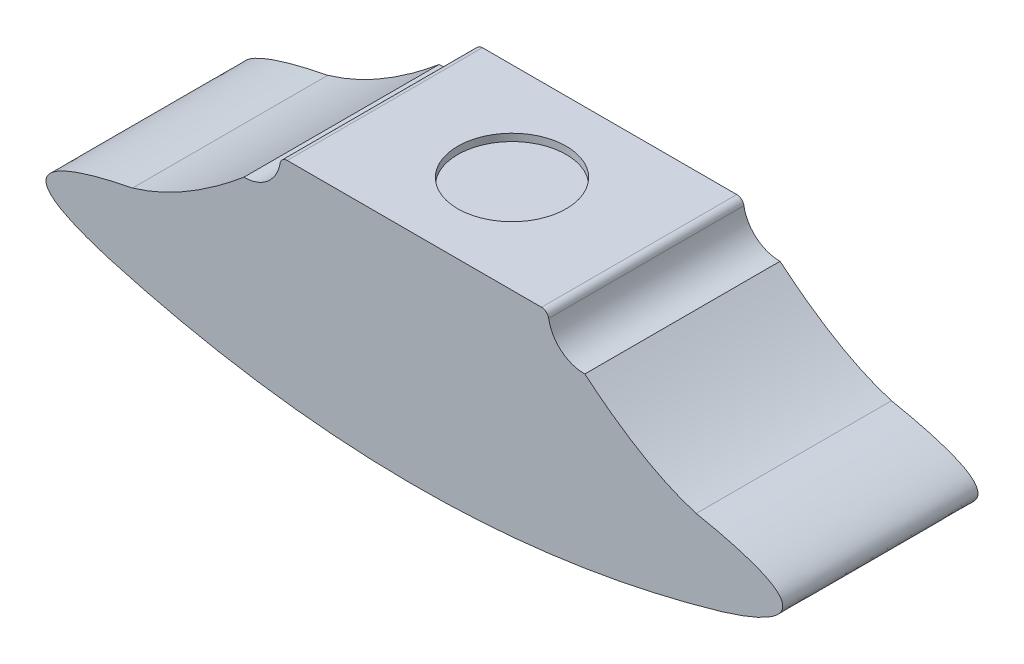
ISO-10303-21;
HEADER;
FILE_DESCRIPTION(('STEP AP214'),'2;1');
FILE_NAME('part.step','',(''),(''),'','','');
FILE_SCHEMA(('AUTOMOTIVE_DESIGN { 1 0 10303 214 1 1 1 1 }'));
ENDSEC;
DATA;
#1=APPLICATION_CONTEXT('core data for automotive mechanical design processes');
#2=APPLICATION_PROTOCOL_DEFINITION('international standard','automotive_design',2000,#1);
#3=PRODUCT_CONTEXT('',#1,'mechanical');
#4=PRODUCT('Part','Part','',(#3));
#5=PRODUCT_RELATED_PRODUCT_CATEGORY('part','',(#4));
#6=PRODUCT_DEFINITION_FORMATION('','',#4);
#7=PRODUCT_DEFINITION_CONTEXT('part definition',#1,'design');
#8=PRODUCT_DEFINITION('design','',#6,#7);
#9=PRODUCT_DEFINITION_SHAPE('','',#8);
#10=(LENGTH_UNIT() NAMED_UNIT(*) SI_UNIT(.MILLI.,.METRE.));
#11=(NAMED_UNIT(*) PLANE_ANGLE_UNIT() SI_UNIT($,.RADIAN.));
#12=(NAMED_UNIT(*) SI_UNIT($,.STERADIAN.) SOLID_ANGLE_UNIT());
#13=UNCERTAINTY_MEASURE_WITH_UNIT(LENGTH_MEASURE(1.E-05),#10,'distance_accuracy_value','');
#14=(GEOMETRIC_REPRESENTATION_CONTEXT(3) GLOBAL_UNCERTAINTY_ASSIGNED_CONTEXT((#13)) GLOBAL_UNIT_ASSIGNED_CONTEXT((#10,
#11,#12)) REPRESENTATION_CONTEXT('',''));
#15=CARTESIAN_POINT('',(0.,0.,0.));
#16=DIRECTION('',(0.,0.,1.));
#17=DIRECTION('',(1.,0.,0.));
#18=AXIS2_PLACEMENT_3D('',#15,#16,#17);
#19=CARTESIAN_POINT('',(0.,24.,27.));
#20=DIRECTION('',(0.,1.,0.));
#21=DIRECTION('',(0.,0.,1.));
#22=AXIS2_PLACEMENT_3D('',#19,#20,#21);
#23=PLANE('',#22);
#24=CARTESIAN_POINT('',(0.,24.,13.5));
#25=DIRECTION('',(0.,1.,0.));
#26=DIRECTION('',(0.,0.,1.));
#27=AXIS2_PLACEMENT_3D('',#24,#25,#26);
#28=CIRCLE('',#27,7.5);
#29=CARTESIAN_POINT('',(0.,24.,21.));
#30=VERTEX_POINT('',#29);
#31=EDGE_CURVE('E418',#30,#30,#28,.T.);
#32=ORIENTED_EDGE('',*,*,#31,.F.);
#33=EDGE_LOOP('',(#32));
#34=FACE_BOUND('',#33,.T.);
#35=DIRECTION('',(1.,0.,0.));
#36=VECTOR('',#35,1.);
#37=CARTESIAN_POINT('',(0.,24.,27.));
#38=LINE('',#37,#36);
#39=CARTESIAN_POINT('',(-17.5839202169004,24.,27.));
#40=VERTEX_POINT('',#39);
#41=CARTESIAN_POINT('',(17.5839202169004,24.,27.));
#42=VERTEX_POINT('',#41);
#43=EDGE_CURVE('E259',#40,#42,#38,.T.);
#44=ORIENTED_EDGE('',*,*,#43,.T.);
#45=DIRECTION('',(0.,0.,-1.));
#46=VECTOR('',#45,1.);
#47=CARTESIAN_POINT('',(17.5839202169004,24.,27.));
#48=LINE('',#47,#46);
#49=CARTESIAN_POINT('',(17.5839202169004,24.,0.));
#50=VERTEX_POINT('',#49);
#51=EDGE_CURVE('E300',#42,#50,#48,.T.);
#52=ORIENTED_EDGE('',*,*,#51,.T.);
#53=DIRECTION('',(1.,0.,0.));
#54=VECTOR('',#53,1.);
#55=CARTESIAN_POINT('',(0.,24.,0.));
#56=LINE('',#55,#54);
#57=CARTESIAN_POINT('',(-17.5839202169004,24.,0.));
#58=VERTEX_POINT('',#57);
#59=EDGE_CURVE('E230',#58,#50,#56,.T.);
#60=ORIENTED_EDGE('',*,*,#59,.F.);
#61=DIRECTION('',(0.,0.,1.));
#62=VECTOR('',#61,1.);
#63=CARTESIAN_POINT('',(-17.5839202169004,24.,27.));
#64=LINE('',#63,#62);
#65=EDGE_CURVE('E296',#58,#40,#64,.T.);
#66=ORIENTED_EDGE('',*,*,#65,.T.);
#67=EDGE_LOOP('',(#44,#52,#60,#66));
#68=FACE_BOUND('',#67,.T.);
#69=ADVANCED_FACE('F35',(#34,#68),#23,.T.);
#70=CARTESIAN_POINT('',(-23.5,24.,27.));
#71=DIRECTION('',(0.,0.,-1.));
#72=DIRECTION('',(-1.,0.,0.));
#73=AXIS2_PLACEMENT_3D('',#70,#71,#72);
#74=CYLINDRICAL_SURFACE('',#73,5.);
#75=CARTESIAN_POINT('',(-23.5,24.,27.));
#76=DIRECTION('',(0.,0.,1.));
#77=DIRECTION('',(1.,0.,0.));
#78=AXIS2_PLACEMENT_3D('',#75,#76,#77);
#79=CIRCLE('',#78,5.);
#80=CARTESIAN_POINT('',(-18.5699335140837,23.1666666666667,27.));
#81=VERTEX_POINT('',#80);
#82=CARTESIAN_POINT('',(-23.5693686050898,19.0004812234948,27.));
#83=VERTEX_POINT('',#82);
#84=EDGE_CURVE('E320',#81,#83,#79,.F.);
#85=ORIENTED_EDGE('',*,*,#84,.F.);
#86=DIRECTION('',(0.,0.,-1.));
#87=VECTOR('',#86,1.);
#88=CARTESIAN_POINT('',(-18.5699335140836,23.1666666666667,27.));
#89=LINE('',#88,#87);
#90=CARTESIAN_POINT('',(-18.5699335140837,23.1666666666667,0.));
#91=VERTEX_POINT('',#90);
#92=EDGE_CURVE('E291',#81,#91,#89,.T.);
#93=ORIENTED_EDGE('',*,*,#92,.T.);
#94=CARTESIAN_POINT('',(-23.5,24.,0.));
#95=DIRECTION('',(0.,0.,1.));
#96=DIRECTION('',(1.,0.,0.));
#97=AXIS2_PLACEMENT_3D('',#94,#95,#96);
#98=CIRCLE('',#97,5.);
#99=CARTESIAN_POINT('',(-23.5693686050898,19.0004812234948,0.));
#100=VERTEX_POINT('',#99);
#101=EDGE_CURVE('E235',#91,#100,#98,.F.);
#102=ORIENTED_EDGE('',*,*,#101,.T.);
#103=DIRECTION('',(0.,0.,-1.));
#104=VECTOR('',#103,1.);
#105=CARTESIAN_POINT('',(-23.5693686050898,19.0004812234948,27.));
#106=LINE('',#105,#104);
#107=EDGE_CURVE('E266',#83,#100,#106,.T.);
#108=ORIENTED_EDGE('',*,*,#107,.F.);
#109=EDGE_LOOP('',(#85,#93,#102,#108));
#110=FACE_BOUND('',#109,.T.);
#111=ADVANCED_FACE('F318',(#110),#74,.F.);
#112=CARTESIAN_POINT('',(-38.9772660337344,9.99999999999999,27.));
#113=CARTESIAN_POINT('',(-31.868069791779,12.0735155705703,27.));
#114=CARTESIAN_POINT('',(-23.5693686050898,19.0004812234948,27.));
#115=B_SPLINE_CURVE_WITH_KNOTS('',2,(#112,#113,#114),.UNSPECIFIED.,.F.,.F.,(3,3),(0.,1.),.UNSPECIFIED.);
#116=DIRECTION('',(0.,0.,-1.));
#117=VECTOR('',#116,1.);
#118=SURFACE_OF_LINEAR_EXTRUSION('',#115,#117);
#119=CARTESIAN_POINT('',(-38.9772660337344,9.99999999999999,0.));
#120=CARTESIAN_POINT('',(-31.868069791779,12.0735155705703,0.));
#121=CARTESIAN_POINT('',(-23.5693686050898,19.0004812234948,0.));
#122=B_SPLINE_CURVE_WITH_KNOTS('',2,(#119,#120,#121),.UNSPECIFIED.,.F.,.F.,(3,3),(0.,1.),.UNSPECIFIED.);
#123=CARTESIAN_POINT('',(-38.9772660337344,9.99999999999999,0.));
#124=VERTEX_POINT('',#123);
#125=EDGE_CURVE('E238',#124,#100,#122,.T.);
#126=ORIENTED_EDGE('',*,*,#125,.F.);
#127=DIRECTION('',(0.,0.,-1.));
#128=VECTOR('',#127,1.);
#129=CARTESIAN_POINT('',(-38.9772660337344,9.99999999999999,27.));
#130=LINE('',#129,#128);
#131=CARTESIAN_POINT('',(-38.9772660337344,9.99999999999999,27.));
#132=VERTEX_POINT('',#131);
#133=EDGE_CURVE('E264',#132,#124,#130,.T.);
#134=ORIENTED_EDGE('',*,*,#133,.F.);
#135=EDGE_CURVE('E323',#132,#83,#115,.T.);
#136=ORIENTED_EDGE('',*,*,#135,.T.);
#137=ORIENTED_EDGE('',*,*,#107,.T.);
#138=EDGE_LOOP('',(#126,#134,#136,#137));
#139=FACE_BOUND('',#138,.T.);
#140=ADVANCED_FACE('F333',(#139),#118,.T.);
#141=CARTESIAN_POINT('',(-42.5,0.,27.));
#142=CARTESIAN_POINT('',(-60.9909197678773,5.63165304959606,27.));
#143=CARTESIAN_POINT('',(-38.9772660337344,9.99999999999999,27.));
#144=B_SPLINE_CURVE_WITH_KNOTS('',2,(#141,#142,#143),.UNSPECIFIED.,.F.,.F.,(3,3),(0.,1.),.UNSPECIFIED.);
#145=DIRECTION('',(0.,0.,-1.));
#146=VECTOR('',#145,1.);
#147=SURFACE_OF_LINEAR_EXTRUSION('',#144,#146);
#148=CARTESIAN_POINT('',(-42.5,0.,0.));
#149=CARTESIAN_POINT('',(-60.9909197678773,5.63165304959606,0.));
#150=CARTESIAN_POINT('',(-38.9772660337344,9.99999999999999,0.));
#151=B_SPLINE_CURVE_WITH_KNOTS('',2,(#148,#149,#150),.UNSPECIFIED.,.F.,.F.,(3,3),(0.,1.),.UNSPECIFIED.);
#152=CARTESIAN_POINT('',(-42.5,0.,0.));
#153=VERTEX_POINT('',#152);
#154=EDGE_CURVE('E243',#153,#124,#151,.T.);
#155=ORIENTED_EDGE('',*,*,#154,.F.);
#156=DIRECTION('',(0.,0.,-1.));
#157=VECTOR('',#156,1.);
#158=CARTESIAN_POINT('',(-42.5,0.,27.));
#159=LINE('',#158,#157);
#160=CARTESIAN_POINT('',(-42.5,0.,27.));
#161=VERTEX_POINT('',#160);
#162=EDGE_CURVE('E224',#161,#153,#159,.T.);
#163=ORIENTED_EDGE('',*,*,#162,.F.);
#164=EDGE_CURVE('E225',#161,#132,#144,.T.);
#165=ORIENTED_EDGE('',*,*,#164,.T.);
#166=ORIENTED_EDGE('',*,*,#133,.T.);
#167=EDGE_LOOP('',(#155,#163,#165,#166));
#168=FACE_BOUND('',#167,.T.);
#169=ADVANCED_FACE('F215',(#168),#147,.T.);
#170=CARTESIAN_POINT('',(42.5,0.,27.));
#171=CARTESIAN_POINT('',(0.266505222664144,-12.277049923479,27.));
#172=CARTESIAN_POINT('',(-42.5,0.,27.));
#173=B_SPLINE_CURVE_WITH_KNOTS('',2,(#170,#171,#172),.UNSPECIFIED.,.F.,.F.,(3,3),(0.,1.),.UNSPECIFIED.);
#174=DIRECTION('',(0.,0.,-1.));
#175=VECTOR('',#174,1.);
#176=SURFACE_OF_LINEAR_EXTRUSION('',#173,#175);
#177=DIRECTION('',(0.,0.,-1.));
#178=VECTOR('',#177,1.);
#179=CARTESIAN_POINT('',(17.5,-5.1108917775472,27.));
#180=LINE('',#179,#178);
#181=CARTESIAN_POINT('',(17.5,-5.11089177662646,0.));
#182=VERTEX_POINT('',#181);
#183=CARTESIAN_POINT('',(17.5,-5.11089177662646,5.));
#184=VERTEX_POINT('',#183);
#185=EDGE_CURVE('E173',#182,#184,#180,.F.);
#186=ORIENTED_EDGE('',*,*,#185,.F.);
#187=CARTESIAN_POINT('',(42.5,0.,0.));
#188=CARTESIAN_POINT('',(0.266505222664144,-12.277049923479,0.));
#189=CARTESIAN_POINT('',(-42.5,0.,0.));
#190=B_SPLINE_CURVE_WITH_KNOTS('',2,(#187,#188,#189),.UNSPECIFIED.,.F.,.F.,(3,3),(0.,1.),.UNSPECIFIED.);
#191=CARTESIAN_POINT('',(42.5,0.,0.));
#192=VERTEX_POINT('',#191);
#193=EDGE_CURVE('E251',#192,#182,#190,.T.);
#194=ORIENTED_EDGE('',*,*,#193,.F.);
#195=DIRECTION('',(0.,0.,-1.));
#196=VECTOR('',#195,1.);
#197=CARTESIAN_POINT('',(42.5,0.,27.));
#198=LINE('',#197,#196);
#199=CARTESIAN_POINT('',(42.5,0.,27.));
#200=VERTEX_POINT('',#199);
#201=EDGE_CURVE('E236',#200,#192,#198,.T.);
#202=ORIENTED_EDGE('',*,*,#201,.F.);
#203=EDGE_CURVE('E218',#200,#161,#173,.T.);
#204=ORIENTED_EDGE('',*,*,#203,.T.);
#205=ORIENTED_EDGE('',*,*,#162,.T.);
#206=CARTESIAN_POINT('',(-17.4999999973664,-5.0845669468024,0.));
#207=VERTEX_POINT('',#206);
#208=EDGE_CURVE('E172',#207,#153,#190,.T.);
#209=ORIENTED_EDGE('',*,*,#208,.F.);
#210=DIRECTION('',(0.,0.,-1.));
#211=VECTOR('',#210,1.);
#212=CARTESIAN_POINT('',(-17.5,-5.08456694648798,27.));
#213=LINE('',#212,#211);
#214=CARTESIAN_POINT('',(-17.5,-5.0845669468024,5.));
#215=VERTEX_POINT('',#214);
#216=EDGE_CURVE('E164',#215,#207,#213,.T.);
#217=ORIENTED_EDGE('',*,*,#216,.F.);
#218=CARTESIAN_POINT('',(42.5,0.,5.));
#219=CARTESIAN_POINT('',(0.266505222664144,-12.277049923479,5.));
#220=CARTESIAN_POINT('',(-42.5,0.,5.));
#221=B_SPLINE_CURVE_WITH_KNOTS('',2,(#218,#219,#220),.UNSPECIFIED.,.F.,.F.,(3,3),(0.,1.),.UNSPECIFIED.);
#222=EDGE_CURVE('E146',#184,#215,#221,.T.);
#223=ORIENTED_EDGE('',*,*,#222,.F.);
#224=EDGE_LOOP('',(#186,#194,#202,#204,#205,#209,#217,#223));
#225=FACE_BOUND('',#224,.T.);
#226=ADVANCED_FACE('F170',(#225),#176,.T.);
#227=CARTESIAN_POINT('',(0.,0.,27.));
#228=DIRECTION('',(0.,0.,1.));
#229=DIRECTION('',(1.,0.,0.));
#230=AXIS2_PLACEMENT_3D('',#227,#228,#229);
#231=PLANE('',#230);
#232=CARTESIAN_POINT('',(23.5,24.,27.));
#233=DIRECTION('',(0.,0.,1.));
#234=DIRECTION('',(1.,0.,0.));
#235=AXIS2_PLACEMENT_3D('',#232,#233,#234);
#236=CIRCLE('',#235,5.);
#237=CARTESIAN_POINT('',(18.5699335140837,23.1666666666667,27.));
#238=VERTEX_POINT('',#237);
#239=CARTESIAN_POINT('',(23.5693686050898,19.0004812234948,27.));
#240=VERTEX_POINT('',#239);
#241=EDGE_CURVE('E390',#238,#240,#236,.T.);
#242=ORIENTED_EDGE('',*,*,#241,.F.);
#243=CARTESIAN_POINT('',(17.5839202169004,23.,27.));
#244=DIRECTION('',(0.,0.,1.));
#245=DIRECTION('',(1.,0.,0.));
#246=AXIS2_PLACEMENT_3D('',#243,#244,#245);
#247=CIRCLE('',#246,1.);
#248=EDGE_CURVE('E11',#238,#42,#247,.T.);
#249=ORIENTED_EDGE('',*,*,#248,.T.);
#250=ORIENTED_EDGE('',*,*,#43,.F.);
#251=CARTESIAN_POINT('',(-17.5839202169004,23.,27.));
#252=DIRECTION('',(0.,0.,1.));
#253=DIRECTION('',(1.,0.,0.));
#254=AXIS2_PLACEMENT_3D('',#251,#252,#253);
#255=CIRCLE('',#254,1.);
#256=EDGE_CURVE('E298',#40,#81,#255,.T.);
#257=ORIENTED_EDGE('',*,*,#256,.T.);
#258=ORIENTED_EDGE('',*,*,#84,.T.);
#259=ORIENTED_EDGE('',*,*,#135,.F.);
#260=ORIENTED_EDGE('',*,*,#164,.F.);
#261=ORIENTED_EDGE('',*,*,#203,.F.);
#262=CARTESIAN_POINT('',(42.5,0.,27.));
#263=CARTESIAN_POINT('',(60.9909197678773,5.63165304959608,27.));
#264=CARTESIAN_POINT('',(38.9772660337344,10.,27.));
#265=B_SPLINE_CURVE_WITH_KNOTS('',2,(#262,#263,#264),.UNSPECIFIED.,.F.,.F.,(3,3),(0.,1.),.UNSPECIFIED.);
#266=CARTESIAN_POINT('',(38.9772660337344,10.,27.));
#267=VERTEX_POINT('',#266);
#268=EDGE_CURVE('E183',#200,#267,#265,.T.);
#269=ORIENTED_EDGE('',*,*,#268,.T.);
#270=CARTESIAN_POINT('',(38.9772660337344,10.,27.));
#271=CARTESIAN_POINT('',(31.868069791779,12.0735155705703,27.));
#272=CARTESIAN_POINT('',(23.5693686050898,19.0004812234948,27.));
#273=B_SPLINE_CURVE_WITH_KNOTS('',2,(#270,#271,#272),.UNSPECIFIED.,.F.,.F.,(3,3),(0.,1.),.UNSPECIFIED.);
#274=EDGE_CURVE('E188',#267,#240,#273,.T.);
#275=ORIENTED_EDGE('',*,*,#274,.T.);
#276=EDGE_LOOP('',(#242,#249,#250,#257,#258,#259,#260,#261,#269,#275));
#277=FACE_BOUND('',#276,.T.);
#278=ADVANCED_FACE('F206',(#277),#231,.T.);
#279=CARTESIAN_POINT('',(0.,0.,0.));
#280=DIRECTION('',(0.,0.,1.));
#281=DIRECTION('',(1.,0.,0.));
#282=AXIS2_PLACEMENT_3D('',#279,#280,#281);
#283=PLANE('',#282);
#284=ORIENTED_EDGE('',*,*,#59,.T.);
#285=CARTESIAN_POINT('',(17.5839202169004,23.,0.));
#286=DIRECTION('',(0.,0.,1.));
#287=DIRECTION('',(1.,0.,0.));
#288=AXIS2_PLACEMENT_3D('',#285,#286,#287);
#289=CIRCLE('',#288,1.);
#290=CARTESIAN_POINT('',(18.5699335140837,23.1666666666667,0.));
#291=VERTEX_POINT('',#290);
#292=EDGE_CURVE('E57',#50,#291,#289,.F.);
#293=ORIENTED_EDGE('',*,*,#292,.T.);
#294=CARTESIAN_POINT('',(23.5,24.,0.));
#295=DIRECTION('',(0.,0.,1.));
#296=DIRECTION('',(1.,0.,0.));
#297=AXIS2_PLACEMENT_3D('',#294,#295,#296);
#298=CIRCLE('',#297,5.);
#299=CARTESIAN_POINT('',(23.5693686050898,19.0004812234948,0.));
#300=VERTEX_POINT('',#299);
#301=EDGE_CURVE('E189',#291,#300,#298,.T.);
#302=ORIENTED_EDGE('',*,*,#301,.T.);
#303=CARTESIAN_POINT('',(38.9772660337344,10.,0.));
#304=CARTESIAN_POINT('',(31.868069791779,12.0735155705703,0.));
#305=CARTESIAN_POINT('',(23.5693686050898,19.0004812234948,0.));
#306=B_SPLINE_CURVE_WITH_KNOTS('',2,(#303,#304,#305),.UNSPECIFIED.,.F.,.F.,(3,3),(0.,1.),.UNSPECIFIED.);
#307=CARTESIAN_POINT('',(38.9772660337344,10.,0.));
#308=VERTEX_POINT('',#307);
#309=EDGE_CURVE('E387',#308,#300,#306,.T.);
#310=ORIENTED_EDGE('',*,*,#309,.F.);
#311=CARTESIAN_POINT('',(42.5,0.,0.));
#312=CARTESIAN_POINT('',(60.9909197678773,5.63165304959608,0.));
#313=CARTESIAN_POINT('',(38.9772660337344,10.,0.));
#314=B_SPLINE_CURVE_WITH_KNOTS('',2,(#311,#312,#313),.UNSPECIFIED.,.F.,.F.,(3,3),(0.,1.),.UNSPECIFIED.);
#315=EDGE_CURVE('E175',#192,#308,#314,.T.);
#316=ORIENTED_EDGE('',*,*,#315,.F.);
#317=ORIENTED_EDGE('',*,*,#193,.T.);
#318=DIRECTION('',(0.,-1.,0.));
#319=VECTOR('',#318,1.);
#320=CARTESIAN_POINT('',(17.5,-10.,0.));
#321=LINE('',#320,#319);
#322=CARTESIAN_POINT('',(17.5,19.,0.));
#323=VERTEX_POINT('',#322);
#324=EDGE_CURVE('E414',#323,#182,#321,.T.);
#325=ORIENTED_EDGE('',*,*,#324,.F.);
#326=CARTESIAN_POINT('',(16.5,19.,0.));
#327=DIRECTION('',(0.,0.,1.));
#328=DIRECTION('',(1.,0.,0.));
#329=AXIS2_PLACEMENT_3D('',#326,#327,#328);
#330=CIRCLE('',#329,1.);
#331=CARTESIAN_POINT('',(16.5,20.,0.));
#332=VERTEX_POINT('',#331);
#333=EDGE_CURVE('E289',#323,#332,#330,.T.);
#334=ORIENTED_EDGE('',*,*,#333,.T.);
#335=DIRECTION('',(1.,0.,0.));
#336=VECTOR('',#335,1.);
#337=CARTESIAN_POINT('',(17.5,20.,0.));
#338=LINE('',#337,#336);
#339=CARTESIAN_POINT('',(-16.5,20.,0.));
#340=VERTEX_POINT('',#339);
#341=EDGE_CURVE('E180',#340,#332,#338,.T.);
#342=ORIENTED_EDGE('',*,*,#341,.F.);
#343=CARTESIAN_POINT('',(-16.5,19.,0.));
#344=DIRECTION('',(0.,0.,1.));
#345=DIRECTION('',(1.,0.,0.));
#346=AXIS2_PLACEMENT_3D('',#343,#344,#345);
#347=CIRCLE('',#346,1.);
#348=CARTESIAN_POINT('',(-17.5,19.,0.));
#349=VERTEX_POINT('',#348);
#350=EDGE_CURVE('E287',#340,#349,#347,.T.);
#351=ORIENTED_EDGE('',*,*,#350,.T.);
#352=DIRECTION('',(0.,-1.,0.));
#353=VECTOR('',#352,1.);
#354=CARTESIAN_POINT('',(-17.5,0.,0.));
#355=LINE('',#354,#353);
#356=EDGE_CURVE('E158',#349,#207,#355,.T.);
#357=ORIENTED_EDGE('',*,*,#356,.T.);
#358=ORIENTED_EDGE('',*,*,#208,.T.);
#359=ORIENTED_EDGE('',*,*,#154,.T.);
#360=ORIENTED_EDGE('',*,*,#125,.T.);
#361=ORIENTED_EDGE('',*,*,#101,.F.);
#362=CARTESIAN_POINT('',(-17.5839202169004,23.,0.));
#363=DIRECTION('',(0.,0.,1.));
#364=DIRECTION('',(1.,0.,0.));
#365=AXIS2_PLACEMENT_3D('',#362,#363,#364);
#366=CIRCLE('',#365,1.);
#367=EDGE_CURVE('E294',#91,#58,#366,.F.);
#368=ORIENTED_EDGE('',*,*,#367,.T.);
#369=EDGE_LOOP('',(#284,#293,#302,#310,#316,#317,#325,#334,#342,#351,#357,#358,#359,#360,#361,#368));
#370=FACE_BOUND('',#369,.T.);
#371=ADVANCED_FACE('F203',(#370),#283,.F.);
#372=DIRECTION('',(0.,0.,-1.));
#373=VECTOR('',#372,1.);
#374=SURFACE_OF_LINEAR_EXTRUSION('',#265,#373);
#375=ORIENTED_EDGE('',*,*,#315,.T.);
#376=DIRECTION('',(0.,0.,-1.));
#377=VECTOR('',#376,1.);
#378=CARTESIAN_POINT('',(38.9772660337344,10.,27.));
#379=LINE('',#378,#377);
#380=EDGE_CURVE('E392',#267,#308,#379,.T.);
#381=ORIENTED_EDGE('',*,*,#380,.F.);
#382=ORIENTED_EDGE('',*,*,#268,.F.);
#383=ORIENTED_EDGE('',*,*,#201,.T.);
#384=EDGE_LOOP('',(#375,#381,#382,#383));
#385=FACE_BOUND('',#384,.T.);
#386=ADVANCED_FACE('F198',(#385),#374,.F.);
#387=DIRECTION('',(0.,0.,-1.));
#388=VECTOR('',#387,1.);
#389=SURFACE_OF_LINEAR_EXTRUSION('',#273,#388);
#390=ORIENTED_EDGE('',*,*,#309,.T.);
#391=DIRECTION('',(0.,0.,-1.));
#392=VECTOR('',#391,1.);
#393=CARTESIAN_POINT('',(23.5693686050898,19.0004812234948,27.));
#394=LINE('',#393,#392);
#395=EDGE_CURVE('E384',#240,#300,#394,.T.);
#396=ORIENTED_EDGE('',*,*,#395,.F.);
#397=ORIENTED_EDGE('',*,*,#274,.F.);
#398=ORIENTED_EDGE('',*,*,#380,.T.);
#399=EDGE_LOOP('',(#390,#396,#397,#398));
#400=FACE_BOUND('',#399,.T.);
#401=ADVANCED_FACE('F202',(#400),#389,.F.);
#402=CARTESIAN_POINT('',(23.5,24.,27.));
#403=DIRECTION('',(0.,0.,-1.));
#404=DIRECTION('',(-1.,0.,0.));
#405=AXIS2_PLACEMENT_3D('',#402,#403,#404);
#406=CYLINDRICAL_SURFACE('',#405,5.);
#407=ORIENTED_EDGE('',*,*,#301,.F.);
#408=DIRECTION('',(0.,0.,-1.));
#409=VECTOR('',#408,1.);
#410=CARTESIAN_POINT('',(18.5699335140837,23.1666666666667,27.));
#411=LINE('',#410,#409);
#412=EDGE_CURVE('E43',#291,#238,#411,.F.);
#413=ORIENTED_EDGE('',*,*,#412,.T.);
#414=ORIENTED_EDGE('',*,*,#241,.T.);
#415=ORIENTED_EDGE('',*,*,#395,.T.);
#416=EDGE_LOOP('',(#407,#413,#414,#415));
#417=FACE_BOUND('',#416,.T.);
#418=ADVANCED_FACE('F375',(#417),#406,.F.);
#419=CARTESIAN_POINT('',(17.5,-10.,5.));
#420=DIRECTION('',(1.,0.,0.));
#421=DIRECTION('',(0.,0.,-1.));
#422=AXIS2_PLACEMENT_3D('',#419,#420,#421);
#423=PLANE('',#422);
#424=DIRECTION('',(0.,-1.,0.));
#425=VECTOR('',#424,1.);
#426=CARTESIAN_POINT('',(17.5,-10.,5.));
#427=LINE('',#426,#425);
#428=CARTESIAN_POINT('',(17.5,19.,5.));
#429=VERTEX_POINT('',#428);
#430=EDGE_CURVE('E152',#429,#184,#427,.T.);
#431=ORIENTED_EDGE('',*,*,#430,.F.);
#432=DIRECTION('',(0.,0.,-1.));
#433=VECTOR('',#432,1.);
#434=CARTESIAN_POINT('',(17.5,19.,0.));
#435=LINE('',#434,#433);
#436=EDGE_CURVE('E284',#429,#323,#435,.T.);
#437=ORIENTED_EDGE('',*,*,#436,.T.);
#438=ORIENTED_EDGE('',*,*,#324,.T.);
#439=ORIENTED_EDGE('',*,*,#185,.T.);
#440=EDGE_LOOP('',(#431,#437,#438,#439));
#441=FACE_BOUND('',#440,.T.);
#442=ADVANCED_FACE('F370',(#441),#423,.F.);
#443=CARTESIAN_POINT('',(17.5,20.,5.));
#444=DIRECTION('',(0.,1.,0.));
#445=DIRECTION('',(0.,0.,1.));
#446=AXIS2_PLACEMENT_3D('',#443,#444,#445);
#447=PLANE('',#446);
#448=DIRECTION('',(1.,0.,0.));
#449=VECTOR('',#448,1.);
#450=CARTESIAN_POINT('',(17.5,20.,5.));
#451=LINE('',#450,#449);
#452=CARTESIAN_POINT('',(-16.5,20.,5.));
#453=VERTEX_POINT('',#452);
#454=CARTESIAN_POINT('',(16.5,20.,5.));
#455=VERTEX_POINT('',#454);
#456=EDGE_CURVE('E168',#453,#455,#451,.T.);
#457=ORIENTED_EDGE('',*,*,#456,.F.);
#458=DIRECTION('',(0.,0.,-1.));
#459=VECTOR('',#458,1.);
#460=CARTESIAN_POINT('',(-16.5,20.,0.));
#461=LINE('',#460,#459);
#462=EDGE_CURVE('E276',#453,#340,#461,.T.);
#463=ORIENTED_EDGE('',*,*,#462,.T.);
#464=ORIENTED_EDGE('',*,*,#341,.T.);
#465=DIRECTION('',(0.,0.,-1.));
#466=VECTOR('',#465,1.);
#467=CARTESIAN_POINT('',(16.5,20.,5.));
#468=LINE('',#467,#466);
#469=EDGE_CURVE('E157',#332,#455,#468,.F.);
#470=ORIENTED_EDGE('',*,*,#469,.T.);
#471=EDGE_LOOP('',(#457,#463,#464,#470));
#472=FACE_BOUND('',#471,.T.);
#473=ADVANCED_FACE('F367',(#472),#447,.F.);
#474=CARTESIAN_POINT('',(-17.5,-10.,5.));
#475=DIRECTION('',(-1.,0.,0.));
#476=DIRECTION('',(0.,0.,1.));
#477=AXIS2_PLACEMENT_3D('',#474,#475,#476);
#478=PLANE('',#477);
#479=ORIENTED_EDGE('',*,*,#356,.F.);
#480=DIRECTION('',(0.,0.,-1.));
#481=VECTOR('',#480,1.);
#482=CARTESIAN_POINT('',(-17.5,19.,5.));
#483=LINE('',#482,#481);
#484=CARTESIAN_POINT('',(-17.5,19.,5.));
#485=VERTEX_POINT('',#484);
#486=EDGE_CURVE('E167',#349,#485,#483,.F.);
#487=ORIENTED_EDGE('',*,*,#486,.T.);
#488=DIRECTION('',(0.,1.,0.));
#489=VECTOR('',#488,1.);
#490=CARTESIAN_POINT('',(-17.5,-10.,5.));
#491=LINE('',#490,#489);
#492=EDGE_CURVE('E149',#215,#485,#491,.T.);
#493=ORIENTED_EDGE('',*,*,#492,.F.);
#494=ORIENTED_EDGE('',*,*,#216,.T.);
#495=EDGE_LOOP('',(#479,#487,#493,#494));
#496=FACE_BOUND('',#495,.T.);
#497=ADVANCED_FACE('F163',(#496),#478,.F.);
#498=CARTESIAN_POINT('',(0.,0.,5.));
#499=DIRECTION('',(0.,0.,1.));
#500=DIRECTION('',(1.,0.,0.));
#501=AXIS2_PLACEMENT_3D('',#498,#499,#500);
#502=PLANE('',#501);
#503=ORIENTED_EDGE('',*,*,#492,.T.);
#504=CARTESIAN_POINT('',(-16.5,19.,5.));
#505=DIRECTION('',(0.,0.,1.));
#506=DIRECTION('',(1.,0.,0.));
#507=AXIS2_PLACEMENT_3D('',#504,#505,#506);
#508=CIRCLE('',#507,1.);
#509=EDGE_CURVE('E282',#485,#453,#508,.F.);
#510=ORIENTED_EDGE('',*,*,#509,.T.);
#511=ORIENTED_EDGE('',*,*,#456,.T.);
#512=CARTESIAN_POINT('',(16.5,19.,5.));
#513=DIRECTION('',(0.,0.,1.));
#514=DIRECTION('',(1.,0.,0.));
#515=AXIS2_PLACEMENT_3D('',#512,#513,#514);
#516=CIRCLE('',#515,1.);
#517=EDGE_CURVE('E280',#455,#429,#516,.F.);
#518=ORIENTED_EDGE('',*,*,#517,.T.);
#519=ORIENTED_EDGE('',*,*,#430,.T.);
#520=ORIENTED_EDGE('',*,*,#222,.T.);
#521=EDGE_LOOP('',(#503,#510,#511,#518,#519,#520));
#522=FACE_BOUND('',#521,.T.);
#523=ADVANCED_FACE('F148',(#522),#502,.F.);
#524=CARTESIAN_POINT('',(-16.5,19.,5.));
#525=DIRECTION('',(0.,0.,1.));
#526=DIRECTION('',(1.,0.,0.));
#527=AXIS2_PLACEMENT_3D('',#524,#525,#526);
#528=CYLINDRICAL_SURFACE('',#527,1.);
#529=ORIENTED_EDGE('',*,*,#509,.F.);
#530=ORIENTED_EDGE('',*,*,#486,.F.);
#531=ORIENTED_EDGE('',*,*,#350,.F.);
#532=ORIENTED_EDGE('',*,*,#462,.F.);
#533=EDGE_LOOP('',(#529,#530,#531,#532));
#534=FACE_BOUND('',#533,.T.);
#535=ADVANCED_FACE('F342',(#534),#528,.F.);
#536=CARTESIAN_POINT('',(16.5,19.,5.));
#537=DIRECTION('',(0.,0.,1.));
#538=DIRECTION('',(1.,0.,0.));
#539=AXIS2_PLACEMENT_3D('',#536,#537,#538);
#540=CYLINDRICAL_SURFACE('',#539,1.);
#541=ORIENTED_EDGE('',*,*,#517,.F.);
#542=ORIENTED_EDGE('',*,*,#469,.F.);
#543=ORIENTED_EDGE('',*,*,#333,.F.);
#544=ORIENTED_EDGE('',*,*,#436,.F.);
#545=EDGE_LOOP('',(#541,#542,#543,#544));
#546=FACE_BOUND('',#545,.T.);
#547=ADVANCED_FACE('F345',(#546),#540,.F.);
#548=CARTESIAN_POINT('',(0.,23.,13.5));
#549=DIRECTION('',(0.,1.,0.));
#550=DIRECTION('',(0.,0.,1.));
#551=AXIS2_PLACEMENT_3D('',#548,#549,#550);
#552=CYLINDRICAL_SURFACE('',#551,7.5);
#553=CARTESIAN_POINT('',(0.,23.,13.5));
#554=DIRECTION('',(0.,1.,0.));
#555=DIRECTION('',(0.,0.,1.));
#556=AXIS2_PLACEMENT_3D('',#553,#554,#555);
#557=CIRCLE('',#556,7.5);
#558=CARTESIAN_POINT('',(0.,23.,21.));
#559=VERTEX_POINT('',#558);
#560=EDGE_CURVE('E416',#559,#559,#557,.T.);
#561=ORIENTED_EDGE('',*,*,#560,.F.);
#562=EDGE_LOOP('',(#561));
#563=FACE_BOUND('',#562,.T.);
#564=ORIENTED_EDGE('',*,*,#31,.T.);
#565=EDGE_LOOP('',(#564));
#566=FACE_BOUND('',#565,.T.);
#567=ADVANCED_FACE('F348',(#563,#566),#552,.F.);
#568=CARTESIAN_POINT('',(0.,23.,13.5));
#569=DIRECTION('',(0.,1.,0.));
#570=DIRECTION('',(0.,0.,1.));
#571=AXIS2_PLACEMENT_3D('',#568,#569,#570);
#572=PLANE('',#571);
#573=ORIENTED_EDGE('',*,*,#560,.T.);
#574=EDGE_LOOP('',(#573));
#575=FACE_BOUND('',#574,.T.);
#576=ADVANCED_FACE('F351',(#575),#572,.T.);
#577=CARTESIAN_POINT('',(-17.5839202169004,23.,27.));
#578=DIRECTION('',(0.,0.,-1.));
#579=DIRECTION('',(-1.,0.,0.));
#580=AXIS2_PLACEMENT_3D('',#577,#578,#579);
#581=CYLINDRICAL_SURFACE('',#580,1.);
#582=ORIENTED_EDGE('',*,*,#256,.F.);
#583=ORIENTED_EDGE('',*,*,#65,.F.);
#584=ORIENTED_EDGE('',*,*,#367,.F.);
#585=ORIENTED_EDGE('',*,*,#92,.F.);
#586=EDGE_LOOP('',(#582,#583,#584,#585));
#587=FACE_BOUND('',#586,.T.);
#588=ADVANCED_FACE('F315',(#587),#581,.T.);
#589=CARTESIAN_POINT('',(17.5839202169004,23.,27.));
#590=DIRECTION('',(0.,0.,-1.));
#591=DIRECTION('',(-1.,0.,0.));
#592=AXIS2_PLACEMENT_3D('',#589,#590,#591);
#593=CYLINDRICAL_SURFACE('',#592,1.);
#594=ORIENTED_EDGE('',*,*,#248,.F.);
#595=ORIENTED_EDGE('',*,*,#412,.F.);
#596=ORIENTED_EDGE('',*,*,#292,.F.);
#597=ORIENTED_EDGE('',*,*,#51,.F.);
#598=EDGE_LOOP('',(#594,#595,#596,#597));
#599=FACE_BOUND('',#598,.T.);
#600=ADVANCED_FACE('F37',(#599),#593,.T.);
#601=CLOSED_SHELL('',(#69,#111,#140,#169,#226,#278,#371,#386,#401,#418,#442,#473,#497,#523,#535,
#547,#567,#576,#588,#600));
#602=MANIFOLD_SOLID_BREP('B2',#601);
#603=ADVANCED_BREP_SHAPE_REPRESENTATION('',(#18,#602),#14);
#604=SHAPE_DEFINITION_REPRESENTATION(#9,#603);
ENDSEC;
END-ISO-10303-21;
